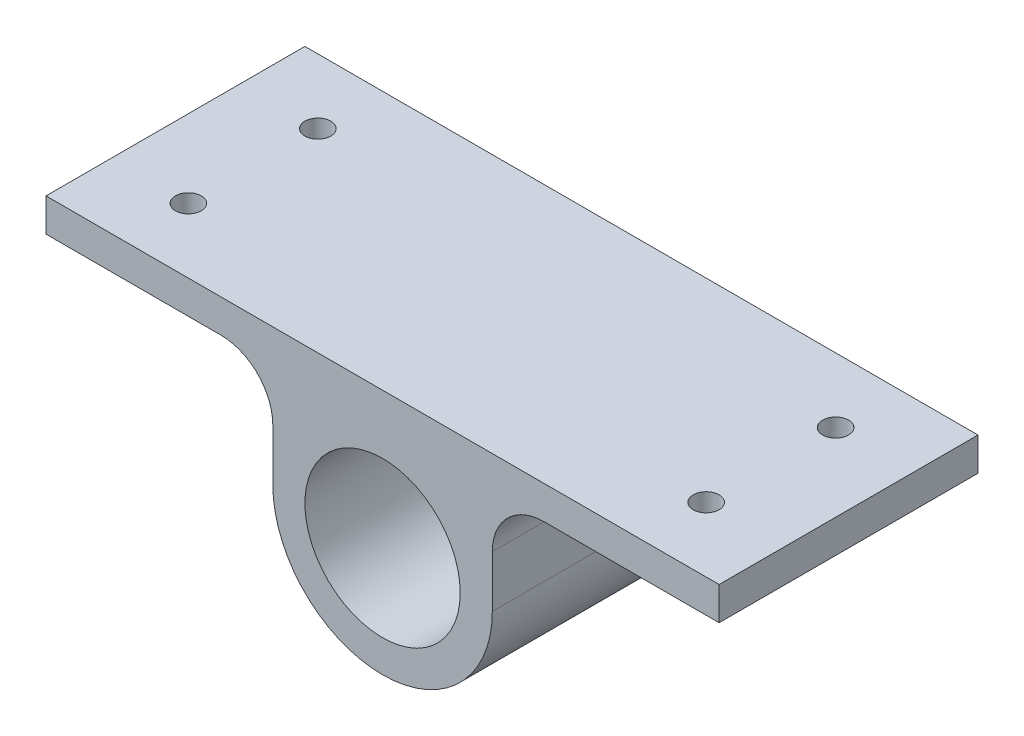
ISO-10303-21;
HEADER;
FILE_DESCRIPTION(('STEP AP214'),'2;1');
FILE_NAME('part.step','',(''),(''),'','','');
FILE_SCHEMA(('AUTOMOTIVE_DESIGN { 1 0 10303 214 1 1 1 1 }'));
ENDSEC;
DATA;
#1=APPLICATION_CONTEXT('core data for automotive mechanical design processes');
#2=APPLICATION_PROTOCOL_DEFINITION('international standard','automotive_design',2000,#1);
#3=PRODUCT_CONTEXT('',#1,'mechanical');
#4=PRODUCT('Part','Part','',(#3));
#5=PRODUCT_RELATED_PRODUCT_CATEGORY('part','',(#4));
#6=PRODUCT_DEFINITION_FORMATION('','',#4);
#7=PRODUCT_DEFINITION_CONTEXT('part definition',#1,'design');
#8=PRODUCT_DEFINITION('design','',#6,#7);
#9=PRODUCT_DEFINITION_SHAPE('','',#8);
#10=(LENGTH_UNIT() NAMED_UNIT(*) SI_UNIT(.MILLI.,.METRE.));
#11=(NAMED_UNIT(*) PLANE_ANGLE_UNIT() SI_UNIT($,.RADIAN.));
#12=(NAMED_UNIT(*) SI_UNIT($,.STERADIAN.) SOLID_ANGLE_UNIT());
#13=UNCERTAINTY_MEASURE_WITH_UNIT(LENGTH_MEASURE(1.E-05),#10,'distance_accuracy_value','');
#14=(GEOMETRIC_REPRESENTATION_CONTEXT(3) GLOBAL_UNCERTAINTY_ASSIGNED_CONTEXT((#13)) GLOBAL_UNIT_ASSIGNED_CONTEXT((#10,
#11,#12)) REPRESENTATION_CONTEXT('',''));
#15=CARTESIAN_POINT('',(0.,0.,0.));
#16=DIRECTION('',(0.,0.,1.));
#17=DIRECTION('',(1.,0.,0.));
#18=AXIS2_PLACEMENT_3D('',#15,#16,#17);
#19=CARTESIAN_POINT('',(0.,0.,250.));
#20=DIRECTION('',(0.,-1.,0.));
#21=DIRECTION('',(1.,0.,0.));
#22=AXIS2_PLACEMENT_3D('',#19,#20,#21);
#23=PLANE('',#22);
#24=CARTESIAN_POINT('',(575.,0.,187.5));
#25=DIRECTION('',(0.,1.,0.));
#26=DIRECTION('',(-1.,0.,0.));
#27=AXIS2_PLACEMENT_3D('',#24,#25,#26);
#28=CIRCLE('',#27,12.5);
#29=CARTESIAN_POINT('',(562.5,0.,187.5));
#30=VERTEX_POINT('',#29);
#31=EDGE_CURVE('E238',#30,#30,#28,.T.);
#32=ORIENTED_EDGE('',*,*,#31,.F.);
#33=EDGE_LOOP('',(#32));
#34=FACE_BOUND('',#33,.T.);
#35=CARTESIAN_POINT('',(75.,0.,187.5));
#36=DIRECTION('',(0.,-1.,0.));
#37=DIRECTION('',(1.,0.,0.));
#38=AXIS2_PLACEMENT_3D('',#35,#36,#37);
#39=CIRCLE('',#38,12.5);
#40=CARTESIAN_POINT('',(87.5,0.,187.5));
#41=VERTEX_POINT('',#40);
#42=EDGE_CURVE('E234',#41,#41,#39,.T.);
#43=ORIENTED_EDGE('',*,*,#42,.T.);
#44=EDGE_LOOP('',(#43));
#45=FACE_BOUND('',#44,.T.);
#46=CARTESIAN_POINT('',(75.,0.,62.5));
#47=DIRECTION('',(0.,-1.,0.));
#48=DIRECTION('',(1.,0.,0.));
#49=AXIS2_PLACEMENT_3D('',#46,#47,#48);
#50=CIRCLE('',#49,12.5);
#51=CARTESIAN_POINT('',(87.5,0.,62.5));
#52=VERTEX_POINT('',#51);
#53=EDGE_CURVE('E231',#52,#52,#50,.T.);
#54=ORIENTED_EDGE('',*,*,#53,.T.);
#55=EDGE_LOOP('',(#54));
#56=FACE_BOUND('',#55,.T.);
#57=DIRECTION('',(-1.,0.,0.));
#58=VECTOR('',#57,1.);
#59=CARTESIAN_POINT('',(0.,0.,0.));
#60=LINE('',#59,#58);
#61=CARTESIAN_POINT('',(650.,0.,0.));
#62=VERTEX_POINT('',#61);
#63=CARTESIAN_POINT('',(0.,0.,0.));
#64=VERTEX_POINT('',#63);
#65=EDGE_CURVE('E95',#62,#64,#60,.T.);
#66=ORIENTED_EDGE('',*,*,#65,.T.);
#67=DIRECTION('',(0.,0.,-1.));
#68=VECTOR('',#67,1.);
#69=CARTESIAN_POINT('',(0.,0.,250.));
#70=LINE('',#69,#68);
#71=CARTESIAN_POINT('',(0.,0.,250.));
#72=VERTEX_POINT('',#71);
#73=EDGE_CURVE('E143',#72,#64,#70,.T.);
#74=ORIENTED_EDGE('',*,*,#73,.F.);
#75=DIRECTION('',(-1.,0.,0.));
#76=VECTOR('',#75,1.);
#77=CARTESIAN_POINT('',(0.,0.,250.));
#78=LINE('',#77,#76);
#79=CARTESIAN_POINT('',(650.,0.,250.));
#80=VERTEX_POINT('',#79);
#81=EDGE_CURVE('E54',#80,#72,#78,.T.);
#82=ORIENTED_EDGE('',*,*,#81,.F.);
#83=DIRECTION('',(0.,0.,-1.));
#84=VECTOR('',#83,1.);
#85=CARTESIAN_POINT('',(650.,0.,250.));
#86=LINE('',#85,#84);
#87=EDGE_CURVE('E139',#80,#62,#86,.T.);
#88=ORIENTED_EDGE('',*,*,#87,.T.);
#89=EDGE_LOOP('',(#66,#74,#82,#88));
#90=FACE_BOUND('',#89,.T.);
#91=CARTESIAN_POINT('',(575.,0.,62.5));
#92=DIRECTION('',(0.,1.,0.));
#93=DIRECTION('',(-1.,0.,0.));
#94=AXIS2_PLACEMENT_3D('',#91,#92,#93);
#95=CIRCLE('',#94,12.5);
#96=CARTESIAN_POINT('',(562.5,0.,62.5));
#97=VERTEX_POINT('',#96);
#98=EDGE_CURVE('E235',#97,#97,#95,.T.);
#99=ORIENTED_EDGE('',*,*,#98,.F.);
#100=EDGE_LOOP('',(#99));
#101=FACE_BOUND('',#100,.T.);
#102=ADVANCED_FACE('F37',(#34,#45,#56,#90,#101),#23,.F.);
#103=CARTESIAN_POINT('',(169.,-82.,250.));
#104=DIRECTION('',(0.,0.,-1.));
#105=DIRECTION('',(-1.,0.,0.));
#106=AXIS2_PLACEMENT_3D('',#103,#104,#105);
#107=PLANE('',#106);
#108=DIRECTION('',(0.,-1.,0.));
#109=VECTOR('',#108,1.);
#110=CARTESIAN_POINT('',(0.,0.,250.));
#111=LINE('',#110,#109);
#112=CARTESIAN_POINT('',(0.,-32.,250.));
#113=VERTEX_POINT('',#112);
#114=EDGE_CURVE('E166',#72,#113,#111,.T.);
#115=ORIENTED_EDGE('',*,*,#114,.T.);
#116=DIRECTION('',(1.,0.,0.));
#117=VECTOR('',#116,1.);
#118=CARTESIAN_POINT('',(169.,-32.,250.));
#119=LINE('',#118,#117);
#120=CARTESIAN_POINT('',(169.,-32.,250.));
#121=VERTEX_POINT('',#120);
#122=EDGE_CURVE('E103',#113,#121,#119,.T.);
#123=ORIENTED_EDGE('',*,*,#122,.T.);
#124=CARTESIAN_POINT('',(169.,-82.,250.));
#125=DIRECTION('',(0.,0.,-1.));
#126=DIRECTION('',(-1.,0.,0.));
#127=AXIS2_PLACEMENT_3D('',#124,#125,#126);
#128=CIRCLE('',#127,50.);
#129=CARTESIAN_POINT('',(219.,-82.0000000000004,250.));
#130=VERTEX_POINT('',#129);
#131=EDGE_CURVE('E187',#121,#130,#128,.T.);
#132=ORIENTED_EDGE('',*,*,#131,.T.);
#133=DIRECTION('',(0.,-1.,0.));
#134=VECTOR('',#133,1.);
#135=CARTESIAN_POINT('',(219.,-132.,250.));
#136=LINE('',#135,#134);
#137=CARTESIAN_POINT('',(219.,-132.,250.));
#138=VERTEX_POINT('',#137);
#139=EDGE_CURVE('E206',#130,#138,#136,.T.);
#140=ORIENTED_EDGE('',*,*,#139,.T.);
#141=CARTESIAN_POINT('',(325.,-132.,250.));
#142=DIRECTION('',(0.,0.,1.));
#143=DIRECTION('',(1.,0.,0.));
#144=AXIS2_PLACEMENT_3D('',#141,#142,#143);
#145=CIRCLE('',#144,106.);
#146=CARTESIAN_POINT('',(431.,-132.,250.));
#147=VERTEX_POINT('',#146);
#148=EDGE_CURVE('E203',#138,#147,#145,.T.);
#149=ORIENTED_EDGE('',*,*,#148,.T.);
#150=DIRECTION('',(0.,1.,0.));
#151=VECTOR('',#150,1.);
#152=CARTESIAN_POINT('',(431.,-132.,250.));
#153=LINE('',#152,#151);
#154=CARTESIAN_POINT('',(431.,-82.0000000000003,250.));
#155=VERTEX_POINT('',#154);
#156=EDGE_CURVE('E205',#147,#155,#153,.T.);
#157=ORIENTED_EDGE('',*,*,#156,.T.);
#158=CARTESIAN_POINT('',(481.,-82.,250.));
#159=DIRECTION('',(0.,0.,-1.));
#160=DIRECTION('',(-1.,0.,0.));
#161=AXIS2_PLACEMENT_3D('',#158,#159,#160);
#162=CIRCLE('',#161,50.);
#163=CARTESIAN_POINT('',(481.,-32.,250.));
#164=VERTEX_POINT('',#163);
#165=EDGE_CURVE('E129',#155,#164,#162,.T.);
#166=ORIENTED_EDGE('',*,*,#165,.T.);
#167=DIRECTION('',(1.,0.,0.));
#168=VECTOR('',#167,1.);
#169=CARTESIAN_POINT('',(481.,-32.,250.));
#170=LINE('',#169,#168);
#171=CARTESIAN_POINT('',(650.,-31.9999999999999,250.));
#172=VERTEX_POINT('',#171);
#173=EDGE_CURVE('E122',#164,#172,#170,.T.);
#174=ORIENTED_EDGE('',*,*,#173,.T.);
#175=DIRECTION('',(0.,1.,0.));
#176=VECTOR('',#175,1.);
#177=CARTESIAN_POINT('',(650.,0.,250.));
#178=LINE('',#177,#176);
#179=EDGE_CURVE('E127',#172,#80,#178,.T.);
#180=ORIENTED_EDGE('',*,*,#179,.T.);
#181=ORIENTED_EDGE('',*,*,#81,.T.);
#182=EDGE_LOOP('',(#115,#123,#132,#140,#149,#157,#166,#174,#180,#181));
#183=FACE_BOUND('',#182,.T.);
#184=CARTESIAN_POINT('',(325.,-132.,250.));
#185=DIRECTION('',(0.,0.,1.));
#186=DIRECTION('',(1.,0.,0.));
#187=AXIS2_PLACEMENT_3D('',#184,#185,#186);
#188=CIRCLE('',#187,75.);
#189=CARTESIAN_POINT('',(400.,-132.,250.));
#190=VERTEX_POINT('',#189);
#191=EDGE_CURVE('E151',#190,#190,#188,.T.);
#192=ORIENTED_EDGE('',*,*,#191,.F.);
#193=EDGE_LOOP('',(#192));
#194=FACE_BOUND('',#193,.T.);
#195=ADVANCED_FACE('F124',(#183,#194),#107,.F.);
#196=CARTESIAN_POINT('',(169.,-82.,0.));
#197=DIRECTION('',(0.,0.,-1.));
#198=DIRECTION('',(-1.,0.,0.));
#199=AXIS2_PLACEMENT_3D('',#196,#197,#198);
#200=PLANE('',#199);
#201=DIRECTION('',(0.,-1.,0.));
#202=VECTOR('',#201,1.);
#203=CARTESIAN_POINT('',(0.,0.,0.));
#204=LINE('',#203,#202);
#205=CARTESIAN_POINT('',(0.,-32.,0.));
#206=VERTEX_POINT('',#205);
#207=EDGE_CURVE('E147',#64,#206,#204,.T.);
#208=ORIENTED_EDGE('',*,*,#207,.F.);
#209=ORIENTED_EDGE('',*,*,#65,.F.);
#210=DIRECTION('',(0.,1.,0.));
#211=VECTOR('',#210,1.);
#212=CARTESIAN_POINT('',(650.,0.,0.));
#213=LINE('',#212,#211);
#214=CARTESIAN_POINT('',(650.,-31.9999999999999,0.));
#215=VERTEX_POINT('',#214);
#216=EDGE_CURVE('E89',#215,#62,#213,.T.);
#217=ORIENTED_EDGE('',*,*,#216,.F.);
#218=DIRECTION('',(1.,0.,0.));
#219=VECTOR('',#218,1.);
#220=CARTESIAN_POINT('',(481.,-32.,0.));
#221=LINE('',#220,#219);
#222=CARTESIAN_POINT('',(481.,-32.,0.));
#223=VERTEX_POINT('',#222);
#224=EDGE_CURVE('E137',#223,#215,#221,.T.);
#225=ORIENTED_EDGE('',*,*,#224,.F.);
#226=CARTESIAN_POINT('',(481.,-82.,0.));
#227=DIRECTION('',(0.,0.,-1.));
#228=DIRECTION('',(-1.,0.,0.));
#229=AXIS2_PLACEMENT_3D('',#226,#227,#228);
#230=CIRCLE('',#229,50.);
#231=CARTESIAN_POINT('',(431.,-82.0000000000003,0.));
#232=VERTEX_POINT('',#231);
#233=EDGE_CURVE('E161',#232,#223,#230,.T.);
#234=ORIENTED_EDGE('',*,*,#233,.F.);
#235=DIRECTION('',(0.,1.,0.));
#236=VECTOR('',#235,1.);
#237=CARTESIAN_POINT('',(431.,-132.,0.));
#238=LINE('',#237,#236);
#239=CARTESIAN_POINT('',(431.,-132.,0.));
#240=VERTEX_POINT('',#239);
#241=EDGE_CURVE('E159',#240,#232,#238,.T.);
#242=ORIENTED_EDGE('',*,*,#241,.F.);
#243=CARTESIAN_POINT('',(325.,-132.,0.));
#244=DIRECTION('',(0.,0.,1.));
#245=DIRECTION('',(1.,0.,0.));
#246=AXIS2_PLACEMENT_3D('',#243,#244,#245);
#247=CIRCLE('',#246,106.);
#248=CARTESIAN_POINT('',(219.,-132.,0.));
#249=VERTEX_POINT('',#248);
#250=EDGE_CURVE('E157',#249,#240,#247,.T.);
#251=ORIENTED_EDGE('',*,*,#250,.F.);
#252=DIRECTION('',(0.,-1.,0.));
#253=VECTOR('',#252,1.);
#254=CARTESIAN_POINT('',(219.,-132.,0.));
#255=LINE('',#254,#253);
#256=CARTESIAN_POINT('',(219.,-82.0000000000004,0.));
#257=VERTEX_POINT('',#256);
#258=EDGE_CURVE('E155',#257,#249,#255,.T.);
#259=ORIENTED_EDGE('',*,*,#258,.F.);
#260=CARTESIAN_POINT('',(169.,-82.,0.));
#261=DIRECTION('',(0.,0.,-1.));
#262=DIRECTION('',(-1.,0.,0.));
#263=AXIS2_PLACEMENT_3D('',#260,#261,#262);
#264=CIRCLE('',#263,50.);
#265=CARTESIAN_POINT('',(169.,-32.,0.));
#266=VERTEX_POINT('',#265);
#267=EDGE_CURVE('E153',#266,#257,#264,.T.);
#268=ORIENTED_EDGE('',*,*,#267,.F.);
#269=DIRECTION('',(1.,0.,0.));
#270=VECTOR('',#269,1.);
#271=CARTESIAN_POINT('',(169.,-32.,0.));
#272=LINE('',#271,#270);
#273=EDGE_CURVE('E150',#206,#266,#272,.T.);
#274=ORIENTED_EDGE('',*,*,#273,.F.);
#275=EDGE_LOOP('',(#208,#209,#217,#225,#234,#242,#251,#259,#268,#274));
#276=FACE_BOUND('',#275,.T.);
#277=CARTESIAN_POINT('',(325.,-132.,0.));
#278=DIRECTION('',(0.,0.,1.));
#279=DIRECTION('',(1.,0.,0.));
#280=AXIS2_PLACEMENT_3D('',#277,#278,#279);
#281=CIRCLE('',#280,75.);
#282=CARTESIAN_POINT('',(400.,-132.,0.));
#283=VERTEX_POINT('',#282);
#284=EDGE_CURVE('E214',#283,#283,#281,.T.);
#285=ORIENTED_EDGE('',*,*,#284,.T.);
#286=EDGE_LOOP('',(#285));
#287=FACE_BOUND('',#286,.T.);
#288=ADVANCED_FACE('F191',(#276,#287),#200,.T.);
#289=CARTESIAN_POINT('',(0.,0.,250.));
#290=DIRECTION('',(1.,0.,0.));
#291=DIRECTION('',(0.,0.,-1.));
#292=AXIS2_PLACEMENT_3D('',#289,#290,#291);
#293=PLANE('',#292);
#294=ORIENTED_EDGE('',*,*,#207,.T.);
#295=DIRECTION('',(0.,0.,-1.));
#296=VECTOR('',#295,1.);
#297=CARTESIAN_POINT('',(0.,-32.,250.));
#298=LINE('',#297,#296);
#299=EDGE_CURVE('E11',#113,#206,#298,.T.);
#300=ORIENTED_EDGE('',*,*,#299,.F.);
#301=ORIENTED_EDGE('',*,*,#114,.F.);
#302=ORIENTED_EDGE('',*,*,#73,.T.);
#303=EDGE_LOOP('',(#294,#300,#301,#302));
#304=FACE_BOUND('',#303,.T.);
#305=ADVANCED_FACE('F39',(#304),#293,.F.);
#306=CARTESIAN_POINT('',(169.,-32.,250.));
#307=DIRECTION('',(0.,1.,0.));
#308=DIRECTION('',(-1.,0.,0.));
#309=AXIS2_PLACEMENT_3D('',#306,#307,#308);
#310=PLANE('',#309);
#311=CARTESIAN_POINT('',(75.,-32.,187.5));
#312=DIRECTION('',(0.,1.,0.));
#313=DIRECTION('',(-1.,0.,0.));
#314=AXIS2_PLACEMENT_3D('',#311,#312,#313);
#315=CIRCLE('',#314,12.5);
#316=CARTESIAN_POINT('',(62.5,-32.,187.5));
#317=VERTEX_POINT('',#316);
#318=EDGE_CURVE('E225',#317,#317,#315,.F.);
#319=ORIENTED_EDGE('',*,*,#318,.F.);
#320=EDGE_LOOP('',(#319));
#321=FACE_BOUND('',#320,.T.);
#322=CARTESIAN_POINT('',(75.,-32.,62.5));
#323=DIRECTION('',(0.,1.,0.));
#324=DIRECTION('',(-1.,0.,0.));
#325=AXIS2_PLACEMENT_3D('',#322,#323,#324);
#326=CIRCLE('',#325,12.5);
#327=CARTESIAN_POINT('',(62.5,-32.,62.5));
#328=VERTEX_POINT('',#327);
#329=EDGE_CURVE('E228',#328,#328,#326,.F.);
#330=ORIENTED_EDGE('',*,*,#329,.F.);
#331=EDGE_LOOP('',(#330));
#332=FACE_BOUND('',#331,.T.);
#333=ORIENTED_EDGE('',*,*,#273,.T.);
#334=DIRECTION('',(0.,0.,-1.));
#335=VECTOR('',#334,1.);
#336=CARTESIAN_POINT('',(169.,-32.,250.));
#337=LINE('',#336,#335);
#338=EDGE_CURVE('E46',#121,#266,#337,.T.);
#339=ORIENTED_EDGE('',*,*,#338,.F.);
#340=ORIENTED_EDGE('',*,*,#122,.F.);
#341=ORIENTED_EDGE('',*,*,#299,.T.);
#342=EDGE_LOOP('',(#333,#339,#340,#341));
#343=FACE_BOUND('',#342,.T.);
#344=ADVANCED_FACE('F254',(#321,#332,#343),#310,.F.);
#345=CARTESIAN_POINT('',(169.,-82.,250.));
#346=DIRECTION('',(0.,0.,-1.));
#347=DIRECTION('',(-1.,0.,0.));
#348=AXIS2_PLACEMENT_3D('',#345,#346,#347);
#349=CYLINDRICAL_SURFACE('',#348,50.);
#350=ORIENTED_EDGE('',*,*,#267,.T.);
#351=DIRECTION('',(0.,0.,-1.));
#352=VECTOR('',#351,1.);
#353=CARTESIAN_POINT('',(219.,-82.0000000000004,250.));
#354=LINE('',#353,#352);
#355=EDGE_CURVE('E179',#130,#257,#354,.T.);
#356=ORIENTED_EDGE('',*,*,#355,.F.);
#357=ORIENTED_EDGE('',*,*,#131,.F.);
#358=ORIENTED_EDGE('',*,*,#338,.T.);
#359=EDGE_LOOP('',(#350,#356,#357,#358));
#360=FACE_BOUND('',#359,.T.);
#361=ADVANCED_FACE('F185',(#360),#349,.F.);
#362=CARTESIAN_POINT('',(219.,-132.,250.));
#363=DIRECTION('',(1.,0.,0.));
#364=DIRECTION('',(0.,0.,-1.));
#365=AXIS2_PLACEMENT_3D('',#362,#363,#364);
#366=PLANE('',#365);
#367=ORIENTED_EDGE('',*,*,#258,.T.);
#368=DIRECTION('',(0.,0.,-1.));
#369=VECTOR('',#368,1.);
#370=CARTESIAN_POINT('',(219.,-132.,250.));
#371=LINE('',#370,#369);
#372=EDGE_CURVE('E176',#138,#249,#371,.T.);
#373=ORIENTED_EDGE('',*,*,#372,.F.);
#374=ORIENTED_EDGE('',*,*,#139,.F.);
#375=ORIENTED_EDGE('',*,*,#355,.T.);
#376=EDGE_LOOP('',(#367,#373,#374,#375));
#377=FACE_BOUND('',#376,.T.);
#378=ADVANCED_FACE('F197',(#377),#366,.F.);
#379=CARTESIAN_POINT('',(325.,-132.,250.));
#380=DIRECTION('',(0.,0.,-1.));
#381=DIRECTION('',(-1.,0.,0.));
#382=AXIS2_PLACEMENT_3D('',#379,#380,#381);
#383=CYLINDRICAL_SURFACE('',#382,106.);
#384=ORIENTED_EDGE('',*,*,#250,.T.);
#385=DIRECTION('',(0.,0.,-1.));
#386=VECTOR('',#385,1.);
#387=CARTESIAN_POINT('',(431.,-132.,250.));
#388=LINE('',#387,#386);
#389=EDGE_CURVE('E173',#147,#240,#388,.T.);
#390=ORIENTED_EDGE('',*,*,#389,.F.);
#391=ORIENTED_EDGE('',*,*,#148,.F.);
#392=ORIENTED_EDGE('',*,*,#372,.T.);
#393=EDGE_LOOP('',(#384,#390,#391,#392));
#394=FACE_BOUND('',#393,.T.);
#395=ADVANCED_FACE('F201',(#394),#383,.T.);
#396=CARTESIAN_POINT('',(431.,-132.,250.));
#397=DIRECTION('',(-1.,0.,0.));
#398=DIRECTION('',(0.,0.,1.));
#399=AXIS2_PLACEMENT_3D('',#396,#397,#398);
#400=PLANE('',#399);
#401=ORIENTED_EDGE('',*,*,#241,.T.);
#402=DIRECTION('',(0.,0.,-1.));
#403=VECTOR('',#402,1.);
#404=CARTESIAN_POINT('',(431.,-82.0000000000003,250.));
#405=LINE('',#404,#403);
#406=EDGE_CURVE('E170',#155,#232,#405,.T.);
#407=ORIENTED_EDGE('',*,*,#406,.F.);
#408=ORIENTED_EDGE('',*,*,#156,.F.);
#409=ORIENTED_EDGE('',*,*,#389,.T.);
#410=EDGE_LOOP('',(#401,#407,#408,#409));
#411=FACE_BOUND('',#410,.T.);
#412=ADVANCED_FACE('F266',(#411),#400,.F.);
#413=CARTESIAN_POINT('',(481.,-82.,250.));
#414=DIRECTION('',(0.,0.,-1.));
#415=DIRECTION('',(-1.,0.,0.));
#416=AXIS2_PLACEMENT_3D('',#413,#414,#415);
#417=CYLINDRICAL_SURFACE('',#416,50.);
#418=ORIENTED_EDGE('',*,*,#233,.T.);
#419=DIRECTION('',(0.,0.,-1.));
#420=VECTOR('',#419,1.);
#421=CARTESIAN_POINT('',(481.,-32.,250.));
#422=LINE('',#421,#420);
#423=EDGE_CURVE('E138',#164,#223,#422,.T.);
#424=ORIENTED_EDGE('',*,*,#423,.F.);
#425=ORIENTED_EDGE('',*,*,#165,.F.);
#426=ORIENTED_EDGE('',*,*,#406,.T.);
#427=EDGE_LOOP('',(#418,#424,#425,#426));
#428=FACE_BOUND('',#427,.T.);
#429=ADVANCED_FACE('F263',(#428),#417,.F.);
#430=CARTESIAN_POINT('',(481.,-32.,250.));
#431=DIRECTION('',(0.,1.,0.));
#432=DIRECTION('',(-1.,0.,0.));
#433=AXIS2_PLACEMENT_3D('',#430,#431,#432);
#434=PLANE('',#433);
#435=CARTESIAN_POINT('',(575.,-31.9999999999999,62.5));
#436=DIRECTION('',(0.,1.,0.));
#437=DIRECTION('',(-1.,0.,0.));
#438=AXIS2_PLACEMENT_3D('',#435,#436,#437);
#439=CIRCLE('',#438,12.5);
#440=CARTESIAN_POINT('',(562.5,-32.,62.5));
#441=VERTEX_POINT('',#440);
#442=EDGE_CURVE('E217',#441,#441,#439,.T.);
#443=ORIENTED_EDGE('',*,*,#442,.T.);
#444=EDGE_LOOP('',(#443));
#445=FACE_BOUND('',#444,.T.);
#446=CARTESIAN_POINT('',(575.,-31.9999999999999,187.5));
#447=DIRECTION('',(0.,1.,0.));
#448=DIRECTION('',(-1.,0.,0.));
#449=AXIS2_PLACEMENT_3D('',#446,#447,#448);
#450=CIRCLE('',#449,12.5);
#451=CARTESIAN_POINT('',(562.5,-32.,187.5));
#452=VERTEX_POINT('',#451);
#453=EDGE_CURVE('E222',#452,#452,#450,.T.);
#454=ORIENTED_EDGE('',*,*,#453,.T.);
#455=EDGE_LOOP('',(#454));
#456=FACE_BOUND('',#455,.T.);
#457=ORIENTED_EDGE('',*,*,#224,.T.);
#458=DIRECTION('',(0.,0.,-1.));
#459=VECTOR('',#458,1.);
#460=CARTESIAN_POINT('',(650.,-31.9999999999999,250.));
#461=LINE('',#460,#459);
#462=EDGE_CURVE('E134',#172,#215,#461,.T.);
#463=ORIENTED_EDGE('',*,*,#462,.F.);
#464=ORIENTED_EDGE('',*,*,#173,.F.);
#465=ORIENTED_EDGE('',*,*,#423,.T.);
#466=EDGE_LOOP('',(#457,#463,#464,#465));
#467=FACE_BOUND('',#466,.T.);
#468=ADVANCED_FACE('F135',(#445,#456,#467),#434,.F.);
#469=CARTESIAN_POINT('',(650.,0.,250.));
#470=DIRECTION('',(-1.,0.,0.));
#471=DIRECTION('',(0.,0.,1.));
#472=AXIS2_PLACEMENT_3D('',#469,#470,#471);
#473=PLANE('',#472);
#474=ORIENTED_EDGE('',*,*,#216,.T.);
#475=ORIENTED_EDGE('',*,*,#87,.F.);
#476=ORIENTED_EDGE('',*,*,#179,.F.);
#477=ORIENTED_EDGE('',*,*,#462,.T.);
#478=EDGE_LOOP('',(#474,#475,#476,#477));
#479=FACE_BOUND('',#478,.T.);
#480=ADVANCED_FACE('F141',(#479),#473,.F.);
#481=CARTESIAN_POINT('',(325.,-132.,250.));
#482=DIRECTION('',(0.,0.,-1.));
#483=DIRECTION('',(-1.,0.,0.));
#484=AXIS2_PLACEMENT_3D('',#481,#482,#483);
#485=CYLINDRICAL_SURFACE('',#484,75.);
#486=ORIENTED_EDGE('',*,*,#191,.T.);
#487=EDGE_LOOP('',(#486));
#488=FACE_BOUND('',#487,.T.);
#489=ORIENTED_EDGE('',*,*,#284,.F.);
#490=EDGE_LOOP('',(#489));
#491=FACE_BOUND('',#490,.T.);
#492=ADVANCED_FACE('F287',(#488,#491),#485,.F.);
#493=CARTESIAN_POINT('',(75.,-238.,62.5));
#494=DIRECTION('',(0.,1.,0.));
#495=DIRECTION('',(-1.,0.,0.));
#496=AXIS2_PLACEMENT_3D('',#493,#494,#495);
#497=CYLINDRICAL_SURFACE('',#496,12.5);
#498=ORIENTED_EDGE('',*,*,#53,.F.);
#499=EDGE_LOOP('',(#498));
#500=FACE_BOUND('',#499,.T.);
#501=ORIENTED_EDGE('',*,*,#329,.T.);
#502=EDGE_LOOP('',(#501));
#503=FACE_BOUND('',#502,.T.);
#504=ADVANCED_FACE('F250',(#500,#503),#497,.F.);
#505=CARTESIAN_POINT('',(75.,-238.,187.5));
#506=DIRECTION('',(0.,1.,0.));
#507=DIRECTION('',(-1.,0.,0.));
#508=AXIS2_PLACEMENT_3D('',#505,#506,#507);
#509=CYLINDRICAL_SURFACE('',#508,12.5);
#510=ORIENTED_EDGE('',*,*,#42,.F.);
#511=EDGE_LOOP('',(#510));
#512=FACE_BOUND('',#511,.T.);
#513=ORIENTED_EDGE('',*,*,#318,.T.);
#514=EDGE_LOOP('',(#513));
#515=FACE_BOUND('',#514,.T.);
#516=ADVANCED_FACE('F246',(#512,#515),#509,.F.);
#517=CARTESIAN_POINT('',(575.,-238.,187.5));
#518=DIRECTION('',(0.,1.,0.));
#519=DIRECTION('',(-1.,0.,0.));
#520=AXIS2_PLACEMENT_3D('',#517,#518,#519);
#521=CYLINDRICAL_SURFACE('',#520,12.5);
#522=ORIENTED_EDGE('',*,*,#31,.T.);
#523=EDGE_LOOP('',(#522));
#524=FACE_BOUND('',#523,.T.);
#525=ORIENTED_EDGE('',*,*,#453,.F.);
#526=EDGE_LOOP('',(#525));
#527=FACE_BOUND('',#526,.T.);
#528=ADVANCED_FACE('F249',(#524,#527),#521,.F.);
#529=CARTESIAN_POINT('',(575.,-238.,62.5));
#530=DIRECTION('',(0.,1.,0.));
#531=DIRECTION('',(-1.,0.,0.));
#532=AXIS2_PLACEMENT_3D('',#529,#530,#531);
#533=CYLINDRICAL_SURFACE('',#532,12.5);
#534=ORIENTED_EDGE('',*,*,#98,.T.);
#535=EDGE_LOOP('',(#534));
#536=FACE_BOUND('',#535,.T.);
#537=ORIENTED_EDGE('',*,*,#442,.F.);
#538=EDGE_LOOP('',(#537));
#539=FACE_BOUND('',#538,.T.);
#540=ADVANCED_FACE('F297',(#536,#539),#533,.F.);
#541=CLOSED_SHELL('',(#102,#195,#288,#305,#344,#361,#378,#395,#412,#429,#468,#480,#492,#504,
#516,#528,#540));
#542=MANIFOLD_SOLID_BREP('B2',#541);
#543=ADVANCED_BREP_SHAPE_REPRESENTATION('',(#18,#542),#14);
#544=SHAPE_DEFINITION_REPRESENTATION(#9,#543);
ENDSEC;
END-ISO-10303-21;
